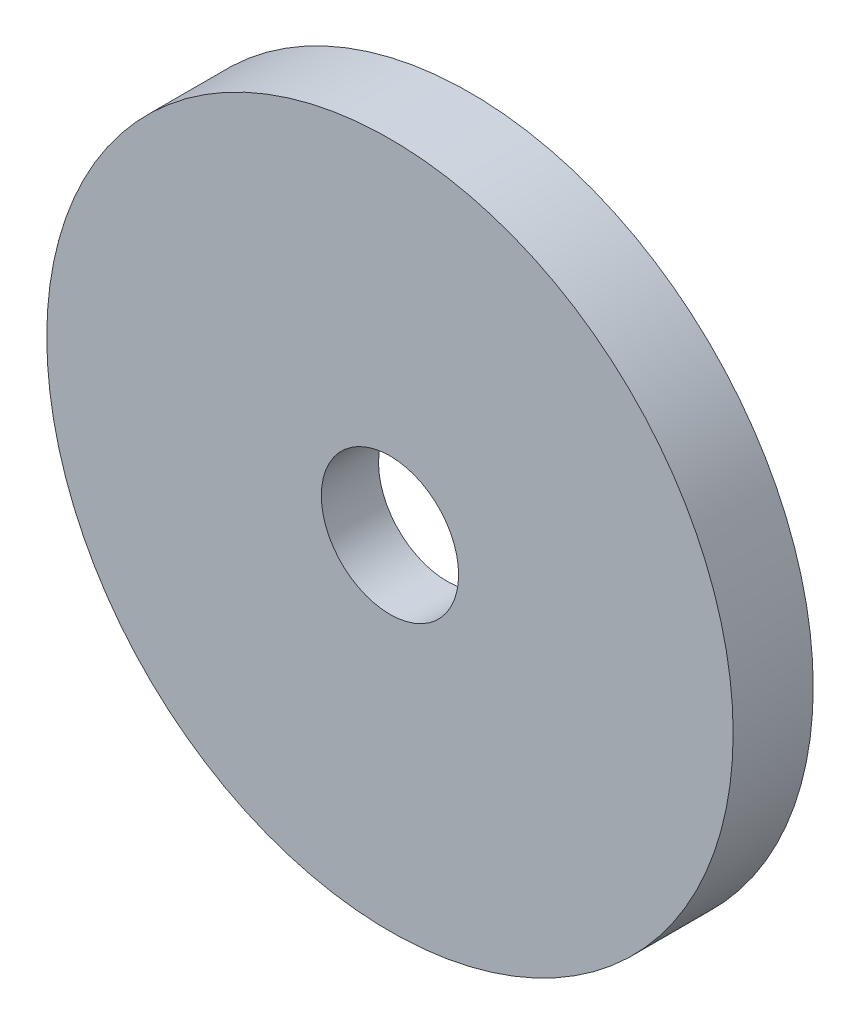
ISO-10303-21;
HEADER;
FILE_DESCRIPTION(('STEP AP214'),'2;1');
FILE_NAME('part.step','',(''),(''),'','','');
FILE_SCHEMA(('AUTOMOTIVE_DESIGN { 1 0 10303 214 1 1 1 1 }'));
ENDSEC;
DATA;
#1=APPLICATION_CONTEXT('core data for automotive mechanical design processes');
#2=APPLICATION_PROTOCOL_DEFINITION('international standard','automotive_design',2000,#1);
#3=PRODUCT_CONTEXT('',#1,'mechanical');
#4=PRODUCT('Part','Part','',(#3));
#5=PRODUCT_RELATED_PRODUCT_CATEGORY('part','',(#4));
#6=PRODUCT_DEFINITION_FORMATION('','',#4);
#7=PRODUCT_DEFINITION_CONTEXT('part definition',#1,'design');
#8=PRODUCT_DEFINITION('design','',#6,#7);
#9=PRODUCT_DEFINITION_SHAPE('','',#8);
#10=(LENGTH_UNIT() NAMED_UNIT(*) SI_UNIT(.MILLI.,.METRE.));
#11=(NAMED_UNIT(*) PLANE_ANGLE_UNIT() SI_UNIT($,.RADIAN.));
#12=(NAMED_UNIT(*) SI_UNIT($,.STERADIAN.) SOLID_ANGLE_UNIT());
#13=UNCERTAINTY_MEASURE_WITH_UNIT(LENGTH_MEASURE(1.E-05),#10,'distance_accuracy_value','');
#14=(GEOMETRIC_REPRESENTATION_CONTEXT(3) GLOBAL_UNCERTAINTY_ASSIGNED_CONTEXT((#13)) GLOBAL_UNIT_ASSIGNED_CONTEXT((#10,
#11,#12)) REPRESENTATION_CONTEXT('',''));
#15=CARTESIAN_POINT('',(0.,0.,0.));
#16=DIRECTION('',(0.,0.,1.));
#17=DIRECTION('',(1.,0.,0.));
#18=AXIS2_PLACEMENT_3D('',#15,#16,#17);
#19=CARTESIAN_POINT('',(0.,0.,6.));
#20=DIRECTION('',(0.,0.,-1.));
#21=DIRECTION('',(-1.,0.,0.));
#22=AXIS2_PLACEMENT_3D('',#19,#20,#21);
#23=CYLINDRICAL_SURFACE('',#22,30.);
#24=CARTESIAN_POINT('',(0.,0.,6.));
#25=DIRECTION('',(0.,0.,1.));
#26=DIRECTION('',(1.,0.,0.));
#27=AXIS2_PLACEMENT_3D('',#24,#25,#26);
#28=CIRCLE('',#27,30.);
#29=CARTESIAN_POINT('',(30.,0.,6.));
#30=VERTEX_POINT('',#29);
#31=EDGE_CURVE('E38',#30,#30,#28,.T.);
#32=ORIENTED_EDGE('',*,*,#31,.F.);
#33=EDGE_LOOP('',(#32));
#34=FACE_BOUND('',#33,.T.);
#35=CARTESIAN_POINT('',(0.,0.,-1.));
#36=DIRECTION('',(0.,0.,-1.));
#37=DIRECTION('',(-1.,0.,0.));
#38=AXIS2_PLACEMENT_3D('',#35,#36,#37);
#39=CIRCLE('',#38,30.);
#40=CARTESIAN_POINT('',(-30.,0.,-1.));
#41=VERTEX_POINT('',#40);
#42=EDGE_CURVE('E46',#41,#41,#39,.T.);
#43=ORIENTED_EDGE('',*,*,#42,.F.);
#44=EDGE_LOOP('',(#43));
#45=FACE_BOUND('',#44,.T.);
#46=ADVANCED_FACE('F32',(#34,#45),#23,.T.);
#47=CARTESIAN_POINT('',(0.,0.,6.));
#48=DIRECTION('',(0.,0.,1.));
#49=DIRECTION('',(1.,0.,0.));
#50=AXIS2_PLACEMENT_3D('',#47,#48,#49);
#51=PLANE('',#50);
#52=CARTESIAN_POINT('',(0.,0.,6.));
#53=DIRECTION('',(0.,0.,1.));
#54=DIRECTION('',(1.,0.,0.));
#55=AXIS2_PLACEMENT_3D('',#52,#53,#54);
#56=CIRCLE('',#55,6.00000000000003);
#57=CARTESIAN_POINT('',(6.00000000000003,0.,6.));
#58=VERTEX_POINT('',#57);
#59=EDGE_CURVE('E42',#58,#58,#56,.T.);
#60=ORIENTED_EDGE('',*,*,#59,.F.);
#61=EDGE_LOOP('',(#60));
#62=FACE_BOUND('',#61,.T.);
#63=ORIENTED_EDGE('',*,*,#31,.T.);
#64=EDGE_LOOP('',(#63));
#65=FACE_BOUND('',#64,.T.);
#66=ADVANCED_FACE('F71',(#62,#65),#51,.T.);
#67=CARTESIAN_POINT('',(0.,0.,7.));
#68=DIRECTION('',(0.,0.,-1.));
#69=DIRECTION('',(-1.,0.,0.));
#70=AXIS2_PLACEMENT_3D('',#67,#68,#69);
#71=CYLINDRICAL_SURFACE('',#70,6.00000000000003);
#72=ORIENTED_EDGE('',*,*,#59,.T.);
#73=EDGE_LOOP('',(#72));
#74=FACE_BOUND('',#73,.T.);
#75=CARTESIAN_POINT('',(0.,0.,1.));
#76=DIRECTION('',(0.,0.,-1.));
#77=DIRECTION('',(-1.,0.,0.));
#78=AXIS2_PLACEMENT_3D('',#75,#76,#77);
#79=CIRCLE('',#78,6.00000000000003);
#80=CARTESIAN_POINT('',(-6.00000000000003,0.,1.));
#81=VERTEX_POINT('',#80);
#82=EDGE_CURVE('E54',#81,#81,#79,.T.);
#83=ORIENTED_EDGE('',*,*,#82,.T.);
#84=EDGE_LOOP('',(#83));
#85=FACE_BOUND('',#84,.T.);
#86=ADVANCED_FACE('F58',(#74,#85),#71,.F.);
#87=CARTESIAN_POINT('',(0.,0.,-1.));
#88=DIRECTION('',(0.,0.,-1.));
#89=DIRECTION('',(-1.,0.,0.));
#90=AXIS2_PLACEMENT_3D('',#87,#88,#89);
#91=PLANE('',#90);
#92=ORIENTED_EDGE('',*,*,#42,.T.);
#93=EDGE_LOOP('',(#92));
#94=FACE_BOUND('',#93,.T.);
#95=CARTESIAN_POINT('',(0.,0.,-1.));
#96=DIRECTION('',(0.,0.,-1.));
#97=DIRECTION('',(-1.,0.,0.));
#98=AXIS2_PLACEMENT_3D('',#95,#96,#97);
#99=CIRCLE('',#98,20.);
#100=CARTESIAN_POINT('',(-20.,0.,-1.));
#101=VERTEX_POINT('',#100);
#102=EDGE_CURVE('E51',#101,#101,#99,.T.);
#103=ORIENTED_EDGE('',*,*,#102,.F.);
#104=EDGE_LOOP('',(#103));
#105=FACE_BOUND('',#104,.T.);
#106=ADVANCED_FACE('F67',(#94,#105),#91,.T.);
#107=CARTESIAN_POINT('',(0.,0.,-1.));
#108=DIRECTION('',(0.,0.,1.));
#109=DIRECTION('',(1.,0.,0.));
#110=AXIS2_PLACEMENT_3D('',#107,#108,#109);
#111=CYLINDRICAL_SURFACE('',#110,20.);
#112=CARTESIAN_POINT('',(0.,0.,1.));
#113=DIRECTION('',(0.,0.,-1.));
#114=DIRECTION('',(-1.,0.,0.));
#115=AXIS2_PLACEMENT_3D('',#112,#113,#114);
#116=CIRCLE('',#115,20.);
#117=CARTESIAN_POINT('',(-20.,0.,1.));
#118=VERTEX_POINT('',#117);
#119=EDGE_CURVE('E10',#118,#118,#116,.T.);
#120=ORIENTED_EDGE('',*,*,#119,.F.);
#121=EDGE_LOOP('',(#120));
#122=FACE_BOUND('',#121,.T.);
#123=ORIENTED_EDGE('',*,*,#102,.T.);
#124=EDGE_LOOP('',(#123));
#125=FACE_BOUND('',#124,.T.);
#126=ADVANCED_FACE('F62',(#122,#125),#111,.F.);
#127=CARTESIAN_POINT('',(0.,0.,1.));
#128=DIRECTION('',(0.,0.,-1.));
#129=DIRECTION('',(-1.,0.,0.));
#130=AXIS2_PLACEMENT_3D('',#127,#128,#129);
#131=PLANE('',#130);
#132=ORIENTED_EDGE('',*,*,#119,.T.);
#133=EDGE_LOOP('',(#132));
#134=FACE_BOUND('',#133,.T.);
#135=ORIENTED_EDGE('',*,*,#82,.F.);
#136=EDGE_LOOP('',(#135));
#137=FACE_BOUND('',#136,.T.);
#138=ADVANCED_FACE('F60',(#134,#137),#131,.T.);
#139=CLOSED_SHELL('',(#46,#66,#86,#106,#126,#138));
#140=MANIFOLD_SOLID_BREP('B2',#139);
#141=ADVANCED_BREP_SHAPE_REPRESENTATION('',(#18,#140),#14);
#142=SHAPE_DEFINITION_REPRESENTATION(#9,#141);
ENDSEC;
END-ISO-10303-21;
